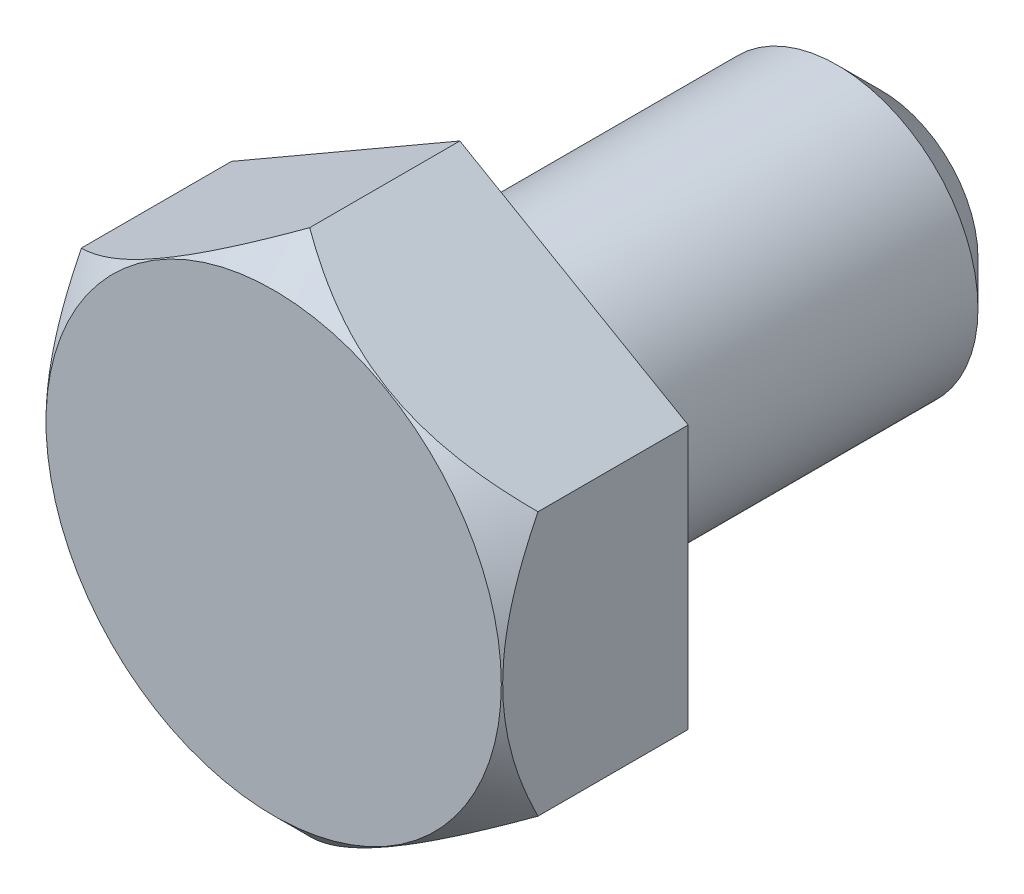
ISO-10303-21;
HEADER;
FILE_DESCRIPTION(('STEP AP214'),'2;1');
FILE_NAME('part.step','',(''),(''),'','','');
FILE_SCHEMA(('AUTOMOTIVE_DESIGN { 1 0 10303 214 1 1 1 1 }'));
ENDSEC;
DATA;
#1=APPLICATION_CONTEXT('core data for automotive mechanical design processes');
#2=APPLICATION_PROTOCOL_DEFINITION('international standard','automotive_design',2000,#1);
#3=PRODUCT_CONTEXT('',#1,'mechanical');
#4=PRODUCT('Part','Part','',(#3));
#5=PRODUCT_RELATED_PRODUCT_CATEGORY('part','',(#4));
#6=PRODUCT_DEFINITION_FORMATION('','',#4);
#7=PRODUCT_DEFINITION_CONTEXT('part definition',#1,'design');
#8=PRODUCT_DEFINITION('design','',#6,#7);
#9=PRODUCT_DEFINITION_SHAPE('','',#8);
#10=(LENGTH_UNIT() NAMED_UNIT(*) SI_UNIT(.MILLI.,.METRE.));
#11=(NAMED_UNIT(*) PLANE_ANGLE_UNIT() SI_UNIT($,.RADIAN.));
#12=(NAMED_UNIT(*) SI_UNIT($,.STERADIAN.) SOLID_ANGLE_UNIT());
#13=UNCERTAINTY_MEASURE_WITH_UNIT(LENGTH_MEASURE(1.E-05),#10,'distance_accuracy_value','');
#14=(GEOMETRIC_REPRESENTATION_CONTEXT(3) GLOBAL_UNCERTAINTY_ASSIGNED_CONTEXT((#13)) GLOBAL_UNIT_ASSIGNED_CONTEXT((#10,
#11,#12)) REPRESENTATION_CONTEXT('',''));
#15=CARTESIAN_POINT('',(0.,0.,0.));
#16=DIRECTION('',(0.,0.,1.));
#17=DIRECTION('',(1.,0.,0.));
#18=AXIS2_PLACEMENT_3D('',#15,#16,#17);
#19=CARTESIAN_POINT('',(6.49999999999999,3.75277674973257,5.3));
#20=DIRECTION('',(-0.5,-0.866025403784439,0.));
#21=DIRECTION('',(0.866025403784439,-0.5,0.));
#22=AXIS2_PLACEMENT_3D('',#19,#20,#21);
#23=PLANE('',#22);
#24=CARTESIAN_POINT('',(6.50019999999999,3.75266127967873,4.27488452728151));
#25=CARTESIAN_POINT('',(6.38843721019526,3.81718755645788,4.33940409659071));
#26=CARTESIAN_POINT('',(6.27581536004747,3.88220981195734,4.40194365055963));
#27=CARTESIAN_POINT('',(6.0486850064995,4.0133435827194,4.5224604185438));
#28=CARTESIAN_POINT('',(5.93417551339819,4.0794556693862,4.58043514082349));
#29=CARTESIAN_POINT('',(5.58649897398135,4.28018681300944,4.74710297110007));
#30=CARTESIAN_POINT('',(5.35038869064092,4.41650514865447,4.84782874227963));
#31=CARTESIAN_POINT('',(4.87425343462842,4.69140196688396,5.02031465124589));
#32=CARTESIAN_POINT('',(4.63435015590494,4.82991018943444,5.09250933509073));
#33=CARTESIAN_POINT('',(4.27055118479009,5.0399496233385,5.17602082300223));
#34=CARTESIAN_POINT('',(4.14874925538919,5.11027200006593,5.19971672805812));
#35=CARTESIAN_POINT('',(3.90411409881776,5.25151217356569,5.23831214646159));
#36=CARTESIAN_POINT('',(3.78128102855289,5.3224298797485,5.25321297437595));
#37=CARTESIAN_POINT('',(3.48195319333876,5.49524688598533,5.27819638214683));
#38=CARTESIAN_POINT('',(3.30513591412532,5.59733238973658,5.2834383368075));
#39=CARTESIAN_POINT('',(2.95182004805228,5.80131940012282,5.27463976445093));
#40=CARTESIAN_POINT('',(2.77532159461785,5.90322082972474,5.26059247821599));
#41=CARTESIAN_POINT('',(2.42398869278335,6.10606297517406,5.21404345827607));
#42=CARTESIAN_POINT('',(2.24915632790757,6.20700248809815,5.18152108717656));
#43=CARTESIAN_POINT('',(1.90249654184426,6.40714660889902,5.09979001738753));
#44=CARTESIAN_POINT('',(1.73066889130018,6.50635134919487,5.05058259820331));
#45=CARTESIAN_POINT('',(1.42564519859871,6.68245686028527,4.94934823857016));
#46=CARTESIAN_POINT('',(1.29177371833438,6.75974759545269,4.89998381384117));
#47=CARTESIAN_POINT('',(1.02643388702305,6.91294161848702,4.79330011001632));
#48=CARTESIAN_POINT('',(0.894965608967257,6.98884486421243,4.73598058975727));
#49=CARTESIAN_POINT('',(0.634846263775285,7.13902483818045,4.61467157245789));
#50=CARTESIAN_POINT('',(0.506187798726439,7.21330583760992,4.55070305109881));
#51=CARTESIAN_POINT('',(0.251253243979178,7.36049237141899,4.41693585160784));
#52=CARTESIAN_POINT('',(0.124975750702144,7.43339871615508,4.34714074890497));
#53=CARTESIAN_POINT('',(-0.000200000000000404,7.50566896951897,4.27488452728151));
#54=B_SPLINE_CURVE_WITH_KNOTS('',3,(#24,#25,#26,#27,#28,#29,#30,#31,#32,#33,#34,#35,#36,#37,#38,
#39,#40,#41,#42,#43,#44,#45,#46,#47,#48,#49,#50,#51,#52,#53),.UNSPECIFIED.,.F.,.F.,(4,2,2,2,2,2,
2,2,2,2,2,2,2,2,4),(0.,0.43282109819845,0.865876839223424,1.7366636469424,2.59362329760356,
3.02126269407585,3.44883815671481,4.06060100939776,4.67257828698747,5.28524051521264,
5.89785577160169,6.38444407043268,6.8710471236855,7.35615917312025,7.84097569580793),.UNSPECIFIED.);
#55=CARTESIAN_POINT('',(6.49999999999999,3.75277674973258,4.275));
#56=VERTEX_POINT('',#55);
#57=CARTESIAN_POINT('',(0.,7.50555349946513,4.275));
#58=VERTEX_POINT('',#57);
#59=EDGE_CURVE('E83',#56,#58,#54,.T.);
#60=ORIENTED_EDGE('',*,*,#59,.F.);
#61=DIRECTION('',(0.,0.,-1.));
#62=VECTOR('',#61,1.);
#63=CARTESIAN_POINT('',(6.49999999999999,3.75277674973257,5.3));
#64=LINE('',#63,#62);
#65=CARTESIAN_POINT('',(6.49999999999999,3.75277674973257,0.));
#66=VERTEX_POINT('',#65);
#67=EDGE_CURVE('E52',#56,#66,#64,.T.);
#68=ORIENTED_EDGE('',*,*,#67,.T.);
#69=DIRECTION('',(-0.866025403784439,0.5,0.));
#70=VECTOR('',#69,1.);
#71=CARTESIAN_POINT('',(6.49999999999999,3.75277674973257,0.));
#72=LINE('',#71,#70);
#73=CARTESIAN_POINT('',(0.,7.50555349946513,0.));
#74=VERTEX_POINT('',#73);
#75=EDGE_CURVE('E91',#66,#74,#72,.T.);
#76=ORIENTED_EDGE('',*,*,#75,.T.);
#77=DIRECTION('',(0.,0.,-1.));
#78=VECTOR('',#77,1.);
#79=CARTESIAN_POINT('',(0.,7.50555349946513,5.3));
#80=LINE('',#79,#78);
#81=EDGE_CURVE('E90',#58,#74,#80,.T.);
#82=ORIENTED_EDGE('',*,*,#81,.F.);
#83=EDGE_LOOP('',(#60,#68,#76,#82));
#84=FACE_BOUND('',#83,.T.);
#85=ADVANCED_FACE('F29',(#84),#23,.F.);
#86=CARTESIAN_POINT('',(0.,7.50555349946513,5.3));
#87=DIRECTION('',(0.5,-0.866025403784439,0.));
#88=DIRECTION('',(0.866025403784439,0.5,0.));
#89=AXIS2_PLACEMENT_3D('',#86,#87,#88);
#90=PLANE('',#89);
#91=CARTESIAN_POINT('',(0.000199999999999162,7.50566896951897,4.27488452728151));
#92=CARTESIAN_POINT('',(-0.111562789804734,7.44114269273983,4.3394040965907));
#93=CARTESIAN_POINT('',(-0.224184639952524,7.37612043724037,4.40194365055963));
#94=CARTESIAN_POINT('',(-0.451314993500499,7.24498666647831,4.5224604185438));
#95=CARTESIAN_POINT('',(-0.565824486601802,7.1788745798115,4.58043514082349));
#96=CARTESIAN_POINT('',(-0.91350102601865,6.97814343618827,4.74710297110007));
#97=CARTESIAN_POINT('',(-1.14961130935908,6.84182510054323,4.84782874227963));
#98=CARTESIAN_POINT('',(-1.62574656537158,6.56692828231374,5.02031465124589));
#99=CARTESIAN_POINT('',(-1.86564984409506,6.42842005976327,5.09250933509074));
#100=CARTESIAN_POINT('',(-2.22944881520991,6.2183806258592,5.17602082300223));
#101=CARTESIAN_POINT('',(-2.35125074461081,6.14805824913178,5.19971672805813));
#102=CARTESIAN_POINT('',(-2.59588590118225,6.00681807563201,5.23831214646159));
#103=CARTESIAN_POINT('',(-2.71871897144711,5.9359003694492,5.25321297437595));
#104=CARTESIAN_POINT('',(-3.01804680666124,5.76308336321237,5.27819638214683));
#105=CARTESIAN_POINT('',(-3.19486408587468,5.66099785946112,5.2834383368075));
#106=CARTESIAN_POINT('',(-3.54817995194772,5.45701084907488,5.27463976445093));
#107=CARTESIAN_POINT('',(-3.72467840538215,5.35510941947296,5.26059247821599));
#108=CARTESIAN_POINT('',(-4.07601130721665,5.15226727402364,5.21404345827607));
#109=CARTESIAN_POINT('',(-4.25084367209243,5.05132776109955,5.18152108717656));
#110=CARTESIAN_POINT('',(-4.59750345815574,4.85118364029868,5.09979001738753));
#111=CARTESIAN_POINT('',(-4.76933110869982,4.75197890000283,5.05058259820331));
#112=CARTESIAN_POINT('',(-5.07435480140129,4.57587338891243,4.94934823857016));
#113=CARTESIAN_POINT('',(-5.20822628166562,4.49858265374501,4.89998381384117));
#114=CARTESIAN_POINT('',(-5.47356611297695,4.34538863071068,4.79330011001632));
#115=CARTESIAN_POINT('',(-5.60503439103274,4.26948538498527,4.73598058975727));
#116=CARTESIAN_POINT('',(-5.86515373622471,4.11930541101726,4.61467157245789));
#117=CARTESIAN_POINT('',(-5.99381220127356,4.04502441158778,4.55070305109881));
#118=CARTESIAN_POINT('',(-6.24874675602082,3.89783787777871,4.41693585160784));
#119=CARTESIAN_POINT('',(-6.37502424929786,3.82493153304262,4.34714074890497));
#120=CARTESIAN_POINT('',(-6.5002,3.75266127967873,4.27488452728151));
#121=B_SPLINE_CURVE_WITH_KNOTS('',3,(#91,#92,#93,#94,#95,#96,#97,#98,#99,#100,#101,#102,#103,
#104,#105,#106,#107,#108,#109,#110,#111,#112,#113,#114,#115,#116,#117,#118,#119,#120),
.UNSPECIFIED.,.F.,.F.,(4,2,2,2,2,2,2,2,2,2,2,2,2,2,4),(0.,0.432821098198451,0.865876839223426,
1.73666364694241,2.59362329760357,3.02126269407585,3.44883815671482,4.06060100939777,
4.67257828698748,5.28524051521265,5.8978557716017,6.38444407043269,6.87104712368551,
7.35615917312025,7.84097569580794),.UNSPECIFIED.);
#122=CARTESIAN_POINT('',(-6.5,3.75277674973257,4.275));
#123=VERTEX_POINT('',#122);
#124=EDGE_CURVE('E92',#58,#123,#121,.T.);
#125=ORIENTED_EDGE('',*,*,#124,.F.);
#126=ORIENTED_EDGE('',*,*,#81,.T.);
#127=DIRECTION('',(-0.866025403784439,-0.5,0.));
#128=VECTOR('',#127,1.);
#129=CARTESIAN_POINT('',(0.,7.50555349946513,0.));
#130=LINE('',#129,#128);
#131=CARTESIAN_POINT('',(-6.5,3.75277674973257,0.));
#132=VERTEX_POINT('',#131);
#133=EDGE_CURVE('E251',#74,#132,#130,.T.);
#134=ORIENTED_EDGE('',*,*,#133,.T.);
#135=DIRECTION('',(0.,0.,-1.));
#136=VECTOR('',#135,1.);
#137=CARTESIAN_POINT('',(-6.5,3.75277674973257,5.3));
#138=LINE('',#137,#136);
#139=EDGE_CURVE('E109',#123,#132,#138,.T.);
#140=ORIENTED_EDGE('',*,*,#139,.F.);
#141=EDGE_LOOP('',(#125,#126,#134,#140));
#142=FACE_BOUND('',#141,.T.);
#143=ADVANCED_FACE('F133',(#142),#90,.F.);
#144=CARTESIAN_POINT('',(-6.5,3.75277674973257,5.3));
#145=DIRECTION('',(1.,0.,0.));
#146=DIRECTION('',(0.,1.,0.));
#147=AXIS2_PLACEMENT_3D('',#144,#145,#146);
#148=PLANE('',#147);
#149=CARTESIAN_POINT('',(-6.5,-7.82388789966134,1.60886623203172));
#150=CARTESIAN_POINT('',(-6.5,-7.63483614240024,1.75424894810936));
#151=CARTESIAN_POINT('',(-6.5,-7.44476484773411,1.89832673565973));
#152=CARTESIAN_POINT('',(-6.5,-7.06216678463162,2.18327654093487));
#153=CARTESIAN_POINT('',(-6.5,-6.86963944515995,2.32414779112595));
#154=CARTESIAN_POINT('',(-6.5,-6.48030586981683,2.6030911344103));
#155=CARTESIAN_POINT('',(-6.5,-6.28347808062893,2.74113324301871));
#156=CARTESIAN_POINT('',(-6.5,-5.88654517921246,3.01240609097263));
#157=CARTESIAN_POINT('',(-6.5,-5.6864402941503,3.14563716178176));
#158=CARTESIAN_POINT('',(-6.5,-5.26962140743596,3.41443485318032));
#159=CARTESIAN_POINT('',(-6.5,-5.05265754825743,3.54961596960879));
#160=CARTESIAN_POINT('',(-6.5,-4.6136352870888,3.81157691927479));
#161=CARTESIAN_POINT('',(-6.5,-4.39157603724715,3.93835534049078));
#162=CARTESIAN_POINT('',(-6.5,-3.94230405698146,4.18081016358544));
#163=CARTESIAN_POINT('',(-6.5,-3.7151090539989,4.29651915775149));
#164=CARTESIAN_POINT('',(-6.5,-3.25430133785382,4.51424272026839));
#165=CARTESIAN_POINT('',(-6.5,-3.0206917125921,4.61626374325472));
#166=CARTESIAN_POINT('',(-6.5,-2.56985145631041,4.79374058813118));
#167=CARTESIAN_POINT('',(-6.5,-2.35326722968045,4.87082175640488));
#168=CARTESIAN_POINT('',(-6.5,-1.91458756499151,5.00764717404105));
#169=CARTESIAN_POINT('',(-6.5,-1.69249177630176,5.06739031731994));
#170=CARTESIAN_POINT('',(-6.5,-1.24797953799915,5.16531273060882));
#171=CARTESIAN_POINT('',(-6.5,-1.02565072675986,5.2038831492301));
#172=CARTESIAN_POINT('',(-6.5,-0.578239417285086,5.25865661642112));
#173=CARTESIAN_POINT('',(-6.5,-0.353157497707014,5.27486428645323));
#174=CARTESIAN_POINT('',(-6.5,0.0876624960115329,5.28353556892345));
#175=CARTESIAN_POINT('',(-6.5,0.303381042677346,5.27700153918724));
#176=CARTESIAN_POINT('',(-6.5,0.733131249355421,5.24284947244533));
#177=CARTESIAN_POINT('',(-6.5,0.947162754095826,5.21522951710794));
#178=CARTESIAN_POINT('',(-6.5,1.37561692104183,5.13999661554566));
#179=CARTESIAN_POINT('',(-6.5,1.58997659695689,5.09203098064061));
#180=CARTESIAN_POINT('',(-6.5,2.0139766270861,4.97876546522138));
#181=CARTESIAN_POINT('',(-6.5,2.22361725153108,4.91346658002831));
#182=CARTESIAN_POINT('',(-6.5,2.64988240408018,4.76416582628056));
#183=CARTESIAN_POINT('',(-6.5,2.86619862886554,4.67929366886046));
#184=CARTESIAN_POINT('',(-6.5,3.29326604114821,4.49643863919671));
#185=CARTESIAN_POINT('',(-6.5,3.50401466602539,4.39844985139637));
#186=CARTESIAN_POINT('',(-6.5,3.9209428084699,4.19168546357565));
#187=CARTESIAN_POINT('',(-6.5,4.12710570822618,4.08287662658809));
#188=CARTESIAN_POINT('',(-6.5,4.53470701224859,3.85686680825807));
#189=CARTESIAN_POINT('',(-6.5,4.73614613808874,3.7396671198818));
#190=CARTESIAN_POINT('',(-6.5,5.12507120848486,3.5044688051455));
#191=CARTESIAN_POINT('',(-6.5,5.3127549317292,3.38679549857201));
#192=CARTESIAN_POINT('',(-6.5,5.68489786732032,3.14644119649296));
#193=CARTESIAN_POINT('',(-6.5,5.86935683637084,3.02375982545558));
#194=CARTESIAN_POINT('',(-6.5,6.23398886377136,2.77528151331559));
#195=CARTESIAN_POINT('',(-6.5,6.41418444490086,2.64951750467711));
#196=CARTESIAN_POINT('',(-6.5,6.77210373282618,2.39461901342412));
#197=CARTESIAN_POINT('',(-6.5,6.94982810731906,2.26548546946086));
#198=CARTESIAN_POINT('',(-6.5,7.1265158832138,2.13497271686326));
#199=B_SPLINE_CURVE_WITH_KNOTS('',3,(#149,#150,#151,#152,#153,#154,#155,#156,#157,#158,#159,
#160,#161,#162,#163,#164,#165,#166,#167,#168,#169,#170,#171,#172,#173,#174,#175,#176,#177,#178,
#179,#180,#181,#182,#183,#184,#185,#186,#187,#188,#189,#190,#191,#192,#193,#194,#195,#196,#197,
#198),.UNSPECIFIED.,.F.,.F.,(4,2,2,2,2,2,2,2,2,2,2,2,2,2,2,2,2,2,2,2,2,2,2,2,4),(0.,
0.715478248737937,1.43112599447957,2.15229556102048,2.87341534634073,3.64015730402257,
4.40702778302171,5.1715659525765,5.93574232339179,6.62482303925433,7.31394770553194,
7.98987171632749,8.66565602043716,9.31203885740317,9.95848050727066,10.6166181262572,
11.2747179614117,11.9712948363302,12.6681869302588,13.3672900541227,14.0662856824306,
14.7307598037351,15.3952838427654,16.0544712531694,16.7134769539292),.UNSPECIFIED.);
#200=CARTESIAN_POINT('',(-6.5,-3.75277674973257,4.275));
#201=VERTEX_POINT('',#200);
#202=EDGE_CURVE('E154',#123,#201,#199,.F.);
#203=ORIENTED_EDGE('',*,*,#202,.F.);
#204=ORIENTED_EDGE('',*,*,#139,.T.);
#205=DIRECTION('',(0.,-1.,0.));
#206=VECTOR('',#205,1.);
#207=CARTESIAN_POINT('',(-6.5,3.75277674973257,0.));
#208=LINE('',#207,#206);
#209=CARTESIAN_POINT('',(-6.5,-3.75277674973257,0.));
#210=VERTEX_POINT('',#209);
#211=EDGE_CURVE('E252',#132,#210,#208,.T.);
#212=ORIENTED_EDGE('',*,*,#211,.T.);
#213=DIRECTION('',(0.,0.,-1.));
#214=VECTOR('',#213,1.);
#215=CARTESIAN_POINT('',(-6.5,-3.75277674973257,5.3));
#216=LINE('',#215,#214);
#217=EDGE_CURVE('E107',#201,#210,#216,.T.);
#218=ORIENTED_EDGE('',*,*,#217,.F.);
#219=EDGE_LOOP('',(#203,#204,#212,#218));
#220=FACE_BOUND('',#219,.T.);
#221=ADVANCED_FACE('F138',(#220),#148,.F.);
#222=CARTESIAN_POINT('',(-6.5,-3.75277674973257,5.3));
#223=DIRECTION('',(0.5,0.866025403784439,0.));
#224=DIRECTION('',(-0.866025403784439,0.5,0.));
#225=AXIS2_PLACEMENT_3D('',#222,#223,#224);
#226=PLANE('',#225);
#227=CARTESIAN_POINT('',(-6.5002,-3.75266127967873,4.27488452728151));
#228=CARTESIAN_POINT('',(-6.38843721019526,-3.81718755645788,4.33940409659071));
#229=CARTESIAN_POINT('',(-6.27581536004747,-3.88220981195734,4.40194365055963));
#230=CARTESIAN_POINT('',(-6.0486850064995,-4.0133435827194,4.52246041854381));
#231=CARTESIAN_POINT('',(-5.93417551339819,-4.0794556693862,4.58043514082349));
#232=CARTESIAN_POINT('',(-5.58649897398135,-4.28018681300944,4.74710297110007));
#233=CARTESIAN_POINT('',(-5.35038869064092,-4.41650514865447,4.84782874227963));
#234=CARTESIAN_POINT('',(-4.87425343462842,-4.69140196688396,5.0203146512459));
#235=CARTESIAN_POINT('',(-4.63435015590494,-4.82991018943443,5.09250933509074));
#236=CARTESIAN_POINT('',(-4.27055118479009,-5.0399496233385,5.17602082300223));
#237=CARTESIAN_POINT('',(-4.14874925538919,-5.11027200006592,5.19971672805813));
#238=CARTESIAN_POINT('',(-3.90411409881775,-5.25151217356569,5.23831214646159));
#239=CARTESIAN_POINT('',(-3.78128102855289,-5.3224298797485,5.25321297437595));
#240=CARTESIAN_POINT('',(-3.48195319333876,-5.49524688598533,5.27819638214683));
#241=CARTESIAN_POINT('',(-3.30513591412532,-5.59733238973658,5.2834383368075));
#242=CARTESIAN_POINT('',(-2.95182004805228,-5.80131940012282,5.27463976445093));
#243=CARTESIAN_POINT('',(-2.77532159461785,-5.90322082972474,5.26059247821599));
#244=CARTESIAN_POINT('',(-2.42398869278335,-6.10606297517406,5.21404345827607));
#245=CARTESIAN_POINT('',(-2.24915632790757,-6.20700248809815,5.18152108717656));
#246=CARTESIAN_POINT('',(-1.90249654184426,-6.40714660889902,5.09979001738753));
#247=CARTESIAN_POINT('',(-1.73066889130017,-6.50635134919487,5.05058259820331));
#248=CARTESIAN_POINT('',(-1.4256451985987,-6.68245686028527,4.94934823857016));
#249=CARTESIAN_POINT('',(-1.29177371833438,-6.75974759545269,4.89998381384117));
#250=CARTESIAN_POINT('',(-1.02643388702305,-6.91294161848702,4.79330011001632));
#251=CARTESIAN_POINT('',(-0.894965608967255,-6.98884486421243,4.73598058975727));
#252=CARTESIAN_POINT('',(-0.634846263775284,-7.13902483818044,4.61467157245789));
#253=CARTESIAN_POINT('',(-0.506187798726439,-7.21330583760992,4.55070305109881));
#254=CARTESIAN_POINT('',(-0.251253243979178,-7.36049237141899,4.41693585160785));
#255=CARTESIAN_POINT('',(-0.124975750702144,-7.43339871615507,4.34714074890497));
#256=CARTESIAN_POINT('',(0.000199999999999828,-7.50566896951897,4.27488452728151));
#257=B_SPLINE_CURVE_WITH_KNOTS('',3,(#227,#228,#229,#230,#231,#232,#233,#234,#235,#236,#237,
#238,#239,#240,#241,#242,#243,#244,#245,#246,#247,#248,#249,#250,#251,#252,#253,#254,#255,#256),
.UNSPECIFIED.,.F.,.F.,(4,2,2,2,2,2,2,2,2,2,2,2,2,2,4),(0.,0.432821098198451,0.865876839223427,
1.73666364694241,2.59362329760357,3.02126269407585,3.44883815671482,4.06060100939776,
4.67257828698747,5.28524051521265,5.89785577160169,6.38444407043269,6.87104712368551,
7.35615917312025,7.84097569580793),.UNSPECIFIED.);
#258=CARTESIAN_POINT('',(0.,-7.50555349946514,4.275));
#259=VERTEX_POINT('',#258);
#260=EDGE_CURVE('E183',#201,#259,#257,.T.);
#261=ORIENTED_EDGE('',*,*,#260,.F.);
#262=ORIENTED_EDGE('',*,*,#217,.T.);
#263=DIRECTION('',(0.866025403784439,-0.5,0.));
#264=VECTOR('',#263,1.);
#265=CARTESIAN_POINT('',(-6.5,-3.75277674973257,0.));
#266=LINE('',#265,#264);
#267=CARTESIAN_POINT('',(0.,-7.50555349946513,0.));
#268=VERTEX_POINT('',#267);
#269=EDGE_CURVE('E257',#210,#268,#266,.T.);
#270=ORIENTED_EDGE('',*,*,#269,.T.);
#271=DIRECTION('',(0.,0.,-1.));
#272=VECTOR('',#271,1.);
#273=CARTESIAN_POINT('',(0.,-7.50555349946513,5.3));
#274=LINE('',#273,#272);
#275=EDGE_CURVE('E100',#259,#268,#274,.T.);
#276=ORIENTED_EDGE('',*,*,#275,.F.);
#277=EDGE_LOOP('',(#261,#262,#270,#276));
#278=FACE_BOUND('',#277,.T.);
#279=ADVANCED_FACE('F143',(#278),#226,.F.);
#280=CARTESIAN_POINT('',(0.,-7.50555349946513,5.3));
#281=DIRECTION('',(-0.5,0.866025403784439,0.));
#282=DIRECTION('',(-0.866025403784439,-0.5,0.));
#283=AXIS2_PLACEMENT_3D('',#280,#281,#282);
#284=PLANE('',#283);
#285=CARTESIAN_POINT('',(-0.000200000000000352,-7.50566896951897,4.27488452728151));
#286=CARTESIAN_POINT('',(0.111562789804733,-7.44114269273982,4.33940409659071));
#287=CARTESIAN_POINT('',(0.224184639952523,-7.37612043724037,4.40194365055963));
#288=CARTESIAN_POINT('',(0.451314993500498,-7.24498666647831,4.5224604185438));
#289=CARTESIAN_POINT('',(0.565824486601802,-7.1788745798115,4.58043514082349));
#290=CARTESIAN_POINT('',(0.91350102601865,-6.97814343618827,4.74710297110007));
#291=CARTESIAN_POINT('',(1.14961130935908,-6.84182510054323,4.84782874227963));
#292=CARTESIAN_POINT('',(1.62574656537158,-6.56692828231374,5.0203146512459));
#293=CARTESIAN_POINT('',(1.86564984409506,-6.42842005976327,5.09250933509074));
#294=CARTESIAN_POINT('',(2.22944881520991,-6.2183806258592,5.17602082300224));
#295=CARTESIAN_POINT('',(2.35125074461081,-6.14805824913178,5.19971672805813));
#296=CARTESIAN_POINT('',(2.59588590118224,-6.00681807563201,5.23831214646159));
#297=CARTESIAN_POINT('',(2.71871897144711,-5.9359003694492,5.25321297437596));
#298=CARTESIAN_POINT('',(3.01804680666124,-5.76308336321237,5.27819638214683));
#299=CARTESIAN_POINT('',(3.19486408587467,-5.66099785946112,5.2834383368075));
#300=CARTESIAN_POINT('',(3.54817995194772,-5.45701084907488,5.27463976445093));
#301=CARTESIAN_POINT('',(3.72467840538215,-5.35510941947296,5.26059247821599));
#302=CARTESIAN_POINT('',(4.07601130721664,-5.15226727402364,5.21404345827607));
#303=CARTESIAN_POINT('',(4.25084367209243,-5.05132776109955,5.18152108717656));
#304=CARTESIAN_POINT('',(4.59750345815574,-4.85118364029868,5.09979001738753));
#305=CARTESIAN_POINT('',(4.76933110869982,-4.75197890000283,5.05058259820332));
#306=CARTESIAN_POINT('',(5.07435480140129,-4.57587338891243,4.94934823857016));
#307=CARTESIAN_POINT('',(5.20822628166562,-4.49858265374501,4.89998381384117));
#308=CARTESIAN_POINT('',(5.47356611297695,-4.34538863071068,4.79330011001632));
#309=CARTESIAN_POINT('',(5.60503439103274,-4.26948538498527,4.73598058975727));
#310=CARTESIAN_POINT('',(5.86515373622471,-4.11930541101726,4.61467157245789));
#311=CARTESIAN_POINT('',(5.99381220127356,-4.04502441158778,4.55070305109881));
#312=CARTESIAN_POINT('',(6.24874675602082,-3.89783787777871,4.41693585160785));
#313=CARTESIAN_POINT('',(6.37502424929785,-3.82493153304263,4.34714074890497));
#314=CARTESIAN_POINT('',(6.5002,-3.75266127967873,4.27488452728151));
#315=B_SPLINE_CURVE_WITH_KNOTS('',3,(#285,#286,#287,#288,#289,#290,#291,#292,#293,#294,#295,
#296,#297,#298,#299,#300,#301,#302,#303,#304,#305,#306,#307,#308,#309,#310,#311,#312,#313,#314),
.UNSPECIFIED.,.F.,.F.,(4,2,2,2,2,2,2,2,2,2,2,2,2,2,4),(0.,0.432821098198451,0.865876839223427,
1.73666364694241,2.59362329760357,3.02126269407585,3.44883815671482,4.06060100939777,
4.67257828698747,5.28524051521265,5.8978557716017,6.38444407043269,6.87104712368551,
7.35615917312025,7.84097569580793),.UNSPECIFIED.);
#316=CARTESIAN_POINT('',(6.5,-3.75277674973257,4.275));
#317=VERTEX_POINT('',#316);
#318=EDGE_CURVE('E44',#259,#317,#315,.T.);
#319=ORIENTED_EDGE('',*,*,#318,.F.);
#320=ORIENTED_EDGE('',*,*,#275,.T.);
#321=DIRECTION('',(0.866025403784439,0.5,0.));
#322=VECTOR('',#321,1.);
#323=CARTESIAN_POINT('',(0.,-7.50555349946513,0.));
#324=LINE('',#323,#322);
#325=CARTESIAN_POINT('',(6.5,-3.75277674973257,0.));
#326=VERTEX_POINT('',#325);
#327=EDGE_CURVE('E102',#268,#326,#324,.T.);
#328=ORIENTED_EDGE('',*,*,#327,.T.);
#329=DIRECTION('',(0.,0.,-1.));
#330=VECTOR('',#329,1.);
#331=CARTESIAN_POINT('',(6.5,-3.75277674973257,5.3));
#332=LINE('',#331,#330);
#333=EDGE_CURVE('E98',#317,#326,#332,.T.);
#334=ORIENTED_EDGE('',*,*,#333,.F.);
#335=EDGE_LOOP('',(#319,#320,#328,#334));
#336=FACE_BOUND('',#335,.T.);
#337=ADVANCED_FACE('F189',(#336),#284,.F.);
#338=CARTESIAN_POINT('',(6.5,-3.75277674973257,5.3));
#339=DIRECTION('',(-1.,0.,0.));
#340=DIRECTION('',(0.,-1.,0.));
#341=AXIS2_PLACEMENT_3D('',#338,#339,#340);
#342=PLANE('',#341);
#343=CARTESIAN_POINT('',(6.5,-7.82388789966134,1.60886623203172));
#344=CARTESIAN_POINT('',(6.5,-7.63483614240024,1.75424894810936));
#345=CARTESIAN_POINT('',(6.5,-7.44476484773411,1.89832673565973));
#346=CARTESIAN_POINT('',(6.5,-7.06216678463162,2.18327654093487));
#347=CARTESIAN_POINT('',(6.5,-6.86963944515995,2.32414779112595));
#348=CARTESIAN_POINT('',(6.5,-6.48030586981682,2.6030911344103));
#349=CARTESIAN_POINT('',(6.5,-6.28347808062893,2.74113324301871));
#350=CARTESIAN_POINT('',(6.5,-5.88654517921246,3.01240609097263));
#351=CARTESIAN_POINT('',(6.5,-5.6864402941503,3.14563716178176));
#352=CARTESIAN_POINT('',(6.5,-5.26962140743595,3.41443485318032));
#353=CARTESIAN_POINT('',(6.5,-5.05265754825743,3.54961596960879));
#354=CARTESIAN_POINT('',(6.5,-4.6136352870888,3.81157691927479));
#355=CARTESIAN_POINT('',(6.5,-4.39157603724715,3.93835534049078));
#356=CARTESIAN_POINT('',(6.5,-3.94230405698145,4.18081016358544));
#357=CARTESIAN_POINT('',(6.5,-3.7151090539989,4.29651915775149));
#358=CARTESIAN_POINT('',(6.5,-3.25430133785382,4.51424272026839));
#359=CARTESIAN_POINT('',(6.5,-3.0206917125921,4.61626374325472));
#360=CARTESIAN_POINT('',(6.5,-2.56985145631041,4.79374058813118));
#361=CARTESIAN_POINT('',(6.5,-2.35326722968045,4.87082175640488));
#362=CARTESIAN_POINT('',(6.5,-1.91458756499151,5.00764717404105));
#363=CARTESIAN_POINT('',(6.5,-1.69249177630176,5.06739031731994));
#364=CARTESIAN_POINT('',(6.5,-1.24797953799915,5.16531273060883));
#365=CARTESIAN_POINT('',(6.5,-1.02565072675986,5.2038831492301));
#366=CARTESIAN_POINT('',(6.5,-0.578239417285082,5.25865661642112));
#367=CARTESIAN_POINT('',(6.5,-0.35315749770701,5.27486428645324));
#368=CARTESIAN_POINT('',(6.5,0.0876624960115377,5.28353556892345));
#369=CARTESIAN_POINT('',(6.5,0.303381042677351,5.27700153918724));
#370=CARTESIAN_POINT('',(6.5,0.733131249355426,5.24284947244533));
#371=CARTESIAN_POINT('',(6.5,0.947162754095831,5.21522951710794));
#372=CARTESIAN_POINT('',(6.5,1.37561692104184,5.13999661554566));
#373=CARTESIAN_POINT('',(6.5,1.5899765969569,5.09203098064062));
#374=CARTESIAN_POINT('',(6.5,2.01397662708611,4.97876546522138));
#375=CARTESIAN_POINT('',(6.5,2.22361725153109,4.91346658002831));
#376=CARTESIAN_POINT('',(6.5,2.64988240408018,4.76416582628056));
#377=CARTESIAN_POINT('',(6.49999999999999,2.86619862886554,4.67929366886047));
#378=CARTESIAN_POINT('',(6.49999999999999,3.29326604114821,4.49643863919671));
#379=CARTESIAN_POINT('',(6.49999999999999,3.50401466602539,4.39844985139637));
#380=CARTESIAN_POINT('',(6.49999999999999,3.9209428084699,4.19168546357566));
#381=CARTESIAN_POINT('',(6.49999999999999,4.12710570822618,4.0828766265881));
#382=CARTESIAN_POINT('',(6.49999999999999,4.53470701224859,3.85686680825808));
#383=CARTESIAN_POINT('',(6.49999999999999,4.73614613808874,3.7396671198818));
#384=CARTESIAN_POINT('',(6.49999999999999,5.12507120848486,3.5044688051455));
#385=CARTESIAN_POINT('',(6.49999999999999,5.31275493172921,3.38679549857202));
#386=CARTESIAN_POINT('',(6.49999999999999,5.68489786732033,3.14644119649296));
#387=CARTESIAN_POINT('',(6.49999999999999,5.86935683637084,3.02375982545558));
#388=CARTESIAN_POINT('',(6.49999999999999,6.23398886377137,2.77528151331559));
#389=CARTESIAN_POINT('',(6.49999999999999,6.41418444490087,2.64951750467711));
#390=CARTESIAN_POINT('',(6.49999999999999,6.77210373282619,2.39461901342412));
#391=CARTESIAN_POINT('',(6.49999999999999,6.94982810731906,2.26548546946087));
#392=CARTESIAN_POINT('',(6.49999999999999,7.1265158832138,2.13497271686326));
#393=B_SPLINE_CURVE_WITH_KNOTS('',3,(#343,#344,#345,#346,#347,#348,#349,#350,#351,#352,#353,
#354,#355,#356,#357,#358,#359,#360,#361,#362,#363,#364,#365,#366,#367,#368,#369,#370,#371,#372,
#373,#374,#375,#376,#377,#378,#379,#380,#381,#382,#383,#384,#385,#386,#387,#388,#389,#390,#391,
#392),.UNSPECIFIED.,.F.,.F.,(4,2,2,2,2,2,2,2,2,2,2,2,2,2,2,2,2,2,2,2,2,2,2,2,4),(0.,
0.715478248737939,1.43112599447958,2.15229556102048,2.87341534634073,3.64015730402258,
4.40702778302171,5.1715659525765,5.93574232339179,6.62482303925433,7.31394770553194,
7.9898717163275,8.66565602043717,9.31203885740318,9.95848050727067,10.6166181262572,
11.2747179614117,11.9712948363302,12.6681869302588,13.3672900541227,14.0662856824306,
14.7307598037352,15.3952838427654,16.0544712531694,16.7134769539292),.UNSPECIFIED.);
#394=EDGE_CURVE('E81',#317,#56,#393,.T.);
#395=ORIENTED_EDGE('',*,*,#394,.F.);
#396=ORIENTED_EDGE('',*,*,#333,.T.);
#397=DIRECTION('',(0.,1.,0.));
#398=VECTOR('',#397,1.);
#399=CARTESIAN_POINT('',(6.5,-3.75277674973257,0.));
#400=LINE('',#399,#398);
#401=EDGE_CURVE('E96',#326,#66,#400,.T.);
#402=ORIENTED_EDGE('',*,*,#401,.T.);
#403=ORIENTED_EDGE('',*,*,#67,.F.);
#404=EDGE_LOOP('',(#395,#396,#402,#403));
#405=FACE_BOUND('',#404,.T.);
#406=ADVANCED_FACE('F94',(#405),#342,.F.);
#407=CARTESIAN_POINT('',(-6.5,11.2583302491977,0.));
#408=DIRECTION('',(0.,0.,1.));
#409=DIRECTION('',(1.,0.,0.));
#410=AXIS2_PLACEMENT_3D('',#407,#408,#409);
#411=PLANE('',#410);
#412=ORIENTED_EDGE('',*,*,#75,.F.);
#413=ORIENTED_EDGE('',*,*,#401,.F.);
#414=ORIENTED_EDGE('',*,*,#327,.F.);
#415=ORIENTED_EDGE('',*,*,#269,.F.);
#416=ORIENTED_EDGE('',*,*,#211,.F.);
#417=ORIENTED_EDGE('',*,*,#133,.F.);
#418=EDGE_LOOP('',(#412,#413,#414,#415,#416,#417));
#419=FACE_BOUND('',#418,.T.);
#420=CARTESIAN_POINT('',(0.,0.,0.));
#421=DIRECTION('',(0.,0.,1.));
#422=DIRECTION('',(1.,0.,0.));
#423=AXIS2_PLACEMENT_3D('',#420,#421,#422);
#424=CIRCLE('',#423,4.);
#425=CARTESIAN_POINT('',(4.,0.,0.));
#426=VERTEX_POINT('',#425);
#427=EDGE_CURVE('E112',#426,#426,#424,.F.);
#428=ORIENTED_EDGE('',*,*,#427,.F.);
#429=EDGE_LOOP('',(#428));
#430=FACE_BOUND('',#429,.T.);
#431=ADVANCED_FACE('F196',(#419,#430),#411,.F.);
#432=CARTESIAN_POINT('',(0.,0.,-12.));
#433=DIRECTION('',(0.,0.,1.));
#434=DIRECTION('',(1.,0.,0.));
#435=AXIS2_PLACEMENT_3D('',#432,#433,#434);
#436=CYLINDRICAL_SURFACE('',#435,4.);
#437=CARTESIAN_POINT('',(0.,0.,-10.75));
#438=DIRECTION('',(0.,0.,-1.));
#439=DIRECTION('',(-1.,0.,0.));
#440=AXIS2_PLACEMENT_3D('',#437,#438,#439);
#441=CIRCLE('',#440,4.);
#442=CARTESIAN_POINT('',(4.,0.,-10.75));
#443=VERTEX_POINT('',#442);
#444=EDGE_CURVE('E11',#443,#443,#441,.F.);
#445=ORIENTED_EDGE('',*,*,#444,.T.);
#446=EDGE_LOOP('',(#445));
#447=FACE_BOUND('',#446,.T.);
#448=ORIENTED_EDGE('',*,*,#427,.T.);
#449=EDGE_LOOP('',(#448));
#450=FACE_BOUND('',#449,.T.);
#451=ADVANCED_FACE('F198',(#447,#450),#436,.T.);
#452=CARTESIAN_POINT('',(0.,0.,-12.));
#453=DIRECTION('',(0.,0.,-1.));
#454=DIRECTION('',(-1.,0.,0.));
#455=AXIS2_PLACEMENT_3D('',#452,#453,#454);
#456=PLANE('',#455);
#457=CARTESIAN_POINT('',(0.,0.,-12.));
#458=DIRECTION('',(0.,0.,-1.));
#459=DIRECTION('',(-1.,0.,0.));
#460=AXIS2_PLACEMENT_3D('',#457,#458,#459);
#461=CIRCLE('',#460,2.75);
#462=CARTESIAN_POINT('',(2.75,0.,-12.));
#463=VERTEX_POINT('',#462);
#464=EDGE_CURVE('E37',#463,#463,#461,.T.);
#465=ORIENTED_EDGE('',*,*,#464,.T.);
#466=EDGE_LOOP('',(#465));
#467=FACE_BOUND('',#466,.T.);
#468=ADVANCED_FACE('F117',(#467),#456,.T.);
#469=CARTESIAN_POINT('',(0.,0.,5.3));
#470=DIRECTION('',(0.,0.,-1.));
#471=DIRECTION('',(-1.,0.,0.));
#472=AXIS2_PLACEMENT_3D('',#469,#470,#471);
#473=CONICAL_SURFACE('',#472,6.48055349946513,0.785398163397448);
#474=CARTESIAN_POINT('',(0.,0.,5.3));
#475=DIRECTION('',(0.,0.,1.));
#476=DIRECTION('',(1.,0.,0.));
#477=AXIS2_PLACEMENT_3D('',#474,#475,#476);
#478=CIRCLE('',#477,6.48055349946513);
#479=CARTESIAN_POINT('',(6.48055349946513,0.,5.3));
#480=VERTEX_POINT('',#479);
#481=EDGE_CURVE('E87',#480,#480,#478,.T.);
#482=ORIENTED_EDGE('',*,*,#481,.F.);
#483=EDGE_LOOP('',(#482));
#484=FACE_BOUND('',#483,.T.);
#485=ORIENTED_EDGE('',*,*,#59,.T.);
#486=ORIENTED_EDGE('',*,*,#124,.T.);
#487=ORIENTED_EDGE('',*,*,#202,.T.);
#488=ORIENTED_EDGE('',*,*,#260,.T.);
#489=ORIENTED_EDGE('',*,*,#318,.T.);
#490=ORIENTED_EDGE('',*,*,#394,.T.);
#491=EDGE_LOOP('',(#485,#486,#487,#488,#489,#490));
#492=FACE_BOUND('',#491,.T.);
#493=ADVANCED_FACE('F82',(#484,#492),#473,.T.);
#494=CARTESIAN_POINT('',(-6.5,11.2583302491977,5.3));
#495=DIRECTION('',(0.,0.,1.));
#496=DIRECTION('',(1.,0.,0.));
#497=AXIS2_PLACEMENT_3D('',#494,#495,#496);
#498=PLANE('',#497);
#499=ORIENTED_EDGE('',*,*,#481,.T.);
#500=EDGE_LOOP('',(#499));
#501=FACE_BOUND('',#500,.T.);
#502=ADVANCED_FACE('F121',(#501),#498,.T.);
#503=CARTESIAN_POINT('',(0.,0.,-12.));
#504=DIRECTION('',(0.,0.,1.));
#505=DIRECTION('',(1.,0.,0.));
#506=AXIS2_PLACEMENT_3D('',#503,#504,#505);
#507=CONICAL_SURFACE('',#506,2.75,0.785398163397448);
#508=CARTESIAN_POINT('',(4.,0.,-10.75));
#509=CARTESIAN_POINT('',(3.98697916666667,0.,-10.7630208333333));
#510=CARTESIAN_POINT('',(3.97395833333333,0.,-10.7760416666667));
#511=CARTESIAN_POINT('',(3.94791666666667,0.,-10.8020833333333));
#512=CARTESIAN_POINT('',(3.93489583333333,0.,-10.8151041666667));
#513=CARTESIAN_POINT('',(3.90885416666667,0.,-10.8411458333333));
#514=CARTESIAN_POINT('',(3.89583333333333,0.,-10.8541666666667));
#515=CARTESIAN_POINT('',(3.86979166666667,0.,-10.8802083333333));
#516=CARTESIAN_POINT('',(3.85677083333333,0.,-10.8932291666667));
#517=CARTESIAN_POINT('',(3.83072916666667,0.,-10.9192708333333));
#518=CARTESIAN_POINT('',(3.81770833333333,0.,-10.9322916666667));
#519=CARTESIAN_POINT('',(3.79166666666667,0.,-10.9583333333333));
#520=CARTESIAN_POINT('',(3.77864583333333,0.,-10.9713541666667));
#521=CARTESIAN_POINT('',(3.75260416666667,0.,-10.9973958333333));
#522=CARTESIAN_POINT('',(3.73958333333333,0.,-11.0104166666667));
#523=CARTESIAN_POINT('',(3.71354166666667,0.,-11.0364583333333));
#524=CARTESIAN_POINT('',(3.70052083333333,0.,-11.0494791666667));
#525=CARTESIAN_POINT('',(3.67447916666667,0.,-11.0755208333333));
#526=CARTESIAN_POINT('',(3.66145833333333,0.,-11.0885416666667));
#527=CARTESIAN_POINT('',(3.63541666666667,0.,-11.1145833333333));
#528=CARTESIAN_POINT('',(3.62239583333333,0.,-11.1276041666667));
#529=CARTESIAN_POINT('',(3.59635416666667,0.,-11.1536458333333));
#530=CARTESIAN_POINT('',(3.58333333333333,0.,-11.1666666666667));
#531=CARTESIAN_POINT('',(3.55729166666667,0.,-11.1927083333333));
#532=CARTESIAN_POINT('',(3.54427083333333,0.,-11.2057291666667));
#533=CARTESIAN_POINT('',(3.51822916666667,0.,-11.2317708333333));
#534=CARTESIAN_POINT('',(3.50520833333333,0.,-11.2447916666667));
#535=CARTESIAN_POINT('',(3.47916666666667,0.,-11.2708333333333));
#536=CARTESIAN_POINT('',(3.46614583333333,0.,-11.2838541666667));
#537=CARTESIAN_POINT('',(3.44010416666667,0.,-11.3098958333333));
#538=CARTESIAN_POINT('',(3.42708333333333,0.,-11.3229166666667));
#539=CARTESIAN_POINT('',(3.40104166666667,0.,-11.3489583333333));
#540=CARTESIAN_POINT('',(3.38802083333333,0.,-11.3619791666667));
#541=CARTESIAN_POINT('',(3.36197916666667,0.,-11.3880208333333));
#542=CARTESIAN_POINT('',(3.34895833333333,0.,-11.4010416666667));
#543=CARTESIAN_POINT('',(3.32291666666667,0.,-11.4270833333333));
#544=CARTESIAN_POINT('',(3.30989583333333,0.,-11.4401041666667));
#545=CARTESIAN_POINT('',(3.28385416666666,0.,-11.4661458333333));
#546=CARTESIAN_POINT('',(3.27083333333333,0.,-11.4791666666667));
#547=CARTESIAN_POINT('',(3.24479166666666,0.,-11.5052083333333));
#548=CARTESIAN_POINT('',(3.23177083333333,0.,-11.5182291666667));
#549=CARTESIAN_POINT('',(3.20572916666666,0.,-11.5442708333333));
#550=CARTESIAN_POINT('',(3.19270833333333,0.,-11.5572916666667));
#551=CARTESIAN_POINT('',(3.16666666666666,0.,-11.5833333333333));
#552=CARTESIAN_POINT('',(3.15364583333333,0.,-11.5963541666667));
#553=CARTESIAN_POINT('',(3.12760416666666,0.,-11.6223958333333));
#554=CARTESIAN_POINT('',(3.11458333333333,0.,-11.6354166666667));
#555=CARTESIAN_POINT('',(3.08854166666666,0.,-11.6614583333333));
#556=CARTESIAN_POINT('',(3.07552083333333,0.,-11.6744791666667));
#557=CARTESIAN_POINT('',(3.04947916666666,0.,-11.7005208333333));
#558=CARTESIAN_POINT('',(3.03645833333333,0.,-11.7135416666667));
#559=CARTESIAN_POINT('',(3.01041666666666,0.,-11.7395833333333));
#560=CARTESIAN_POINT('',(2.99739583333333,0.,-11.7526041666667));
#561=CARTESIAN_POINT('',(2.97135416666666,0.,-11.7786458333333));
#562=CARTESIAN_POINT('',(2.95833333333333,0.,-11.7916666666667));
#563=CARTESIAN_POINT('',(2.93229166666666,0.,-11.8177083333333));
#564=CARTESIAN_POINT('',(2.91927083333333,0.,-11.8307291666667));
#565=CARTESIAN_POINT('',(2.89322916666666,0.,-11.8567708333333));
#566=CARTESIAN_POINT('',(2.88020833333333,0.,-11.8697916666667));
#567=CARTESIAN_POINT('',(2.85416666666666,0.,-11.8958333333333));
#568=CARTESIAN_POINT('',(2.84114583333333,0.,-11.9088541666667));
#569=CARTESIAN_POINT('',(2.81510416666666,0.,-11.9348958333333));
#570=CARTESIAN_POINT('',(2.80208333333333,0.,-11.9479166666667));
#571=CARTESIAN_POINT('',(2.77604166666666,0.,-11.9739583333333));
#572=CARTESIAN_POINT('',(2.76302083333333,0.,-11.9869791666667));
#573=CARTESIAN_POINT('',(2.75,0.,-12.));
#574=B_SPLINE_CURVE_WITH_KNOTS('',3,(#508,#509,#510,#511,#512,#513,#514,#515,#516,#517,#518,
#519,#520,#521,#522,#523,#524,#525,#526,#527,#528,#529,#530,#531,#532,#533,#534,#535,#536,#537,
#538,#539,#540,#541,#542,#543,#544,#545,#546,#547,#548,#549,#550,#551,#552,#553,#554,#555,#556,
#557,#558,#559,#560,#561,#562,#563,#564,#565,#566,#567,#568,#569,#570,#571,#572,#573),
.UNSPECIFIED.,.F.,.F.,(4,2,2,2,2,2,2,2,2,2,2,2,2,2,2,2,2,2,2,2,2,2,2,2,2,2,2,2,2,2,2,2,4),(0.,
0.0552427172801985,0.110485434560399,0.165728151840597,0.220970869120797,0.276213586400997,
0.331456303681195,0.386699020961395,0.441941738241593,0.497184455521793,0.552427172801991,
0.607669890082191,0.662912607362391,0.71815532464259,0.77339804192279,0.828640759202988,
0.883883476483188,0.939126193763387,0.994368911043586,1.04961162832379,1.10485434560398,
1.16009706288418,1.21533978016438,1.27058249744458,1.32582521472478,1.38106793200498,
1.43631064928518,1.49155336656538,1.54679608384558,1.60203880112578,1.65728151840598,
1.71252423568618,1.76776695296638),.UNSPECIFIED.);
#575=EDGE_CURVE('BSEAM119',#443,#463,#574,.T.);
#576=ORIENTED_EDGE('',*,*,#444,.F.);
#577=ORIENTED_EDGE('',*,*,#464,.F.);
#578=ORIENTED_EDGE('',*,*,#575,.T.);
#579=ORIENTED_EDGE('',*,*,#575,.F.);
#580=EDGE_LOOP('',(#576,#578,#577,#579));
#581=FACE_BOUND('',#580,.T.);
#582=ADVANCED_FACE('F119',(#581),#507,.T.);
#583=CLOSED_SHELL('',(#85,#143,#221,#279,#337,#406,#431,#451,#468,#493,#502,#582));
#584=MANIFOLD_SOLID_BREP('B2',#583);
#585=ADVANCED_BREP_SHAPE_REPRESENTATION('',(#18,#584),#14);
#586=SHAPE_DEFINITION_REPRESENTATION(#9,#585);
ENDSEC;
END-ISO-10303-21;
